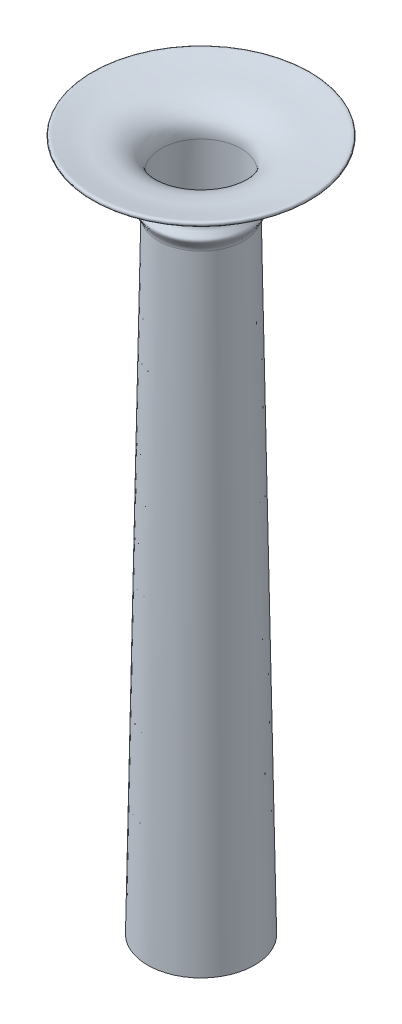
ISO-10303-21;
HEADER;
FILE_DESCRIPTION(('STEP AP214'),'2;1');
FILE_NAME('part.step','',(''),(''),'','','');
FILE_SCHEMA(('AUTOMOTIVE_DESIGN { 1 0 10303 214 1 1 1 1 }'));
ENDSEC;
DATA;
#1=APPLICATION_CONTEXT('core data for automotive mechanical design processes');
#2=APPLICATION_PROTOCOL_DEFINITION('international standard','automotive_design',2000,#1);
#3=PRODUCT_CONTEXT('',#1,'mechanical');
#4=PRODUCT('Part','Part','',(#3));
#5=PRODUCT_RELATED_PRODUCT_CATEGORY('part','',(#4));
#6=PRODUCT_DEFINITION_FORMATION('','',#4);
#7=PRODUCT_DEFINITION_CONTEXT('part definition',#1,'design');
#8=PRODUCT_DEFINITION('design','',#6,#7);
#9=PRODUCT_DEFINITION_SHAPE('','',#8);
#10=(LENGTH_UNIT() NAMED_UNIT(*) SI_UNIT(.MILLI.,.METRE.));
#11=(NAMED_UNIT(*) PLANE_ANGLE_UNIT() SI_UNIT($,.RADIAN.));
#12=(NAMED_UNIT(*) SI_UNIT($,.STERADIAN.) SOLID_ANGLE_UNIT());
#13=UNCERTAINTY_MEASURE_WITH_UNIT(LENGTH_MEASURE(1.E-05),#10,'distance_accuracy_value','');
#14=(GEOMETRIC_REPRESENTATION_CONTEXT(3) GLOBAL_UNCERTAINTY_ASSIGNED_CONTEXT((#13)) GLOBAL_UNIT_ASSIGNED_CONTEXT((#10,
#11,#12)) REPRESENTATION_CONTEXT('',''));
#15=CARTESIAN_POINT('',(0.,0.,0.));
#16=DIRECTION('',(0.,0.,1.));
#17=DIRECTION('',(1.,0.,0.));
#18=AXIS2_PLACEMENT_3D('',#15,#16,#17);
#19=CARTESIAN_POINT('',(-13.,0.,0.));
#20=DIRECTION('',(0.,1.,0.));
#21=DIRECTION('',(0.,0.,1.));
#22=AXIS2_PLACEMENT_3D('',#19,#20,#21);
#23=PLANE('',#22);
#24=CARTESIAN_POINT('',(0.,0.,0.));
#25=DIRECTION('',(0.,-1.,0.));
#26=DIRECTION('',(0.,0.,-1.));
#27=AXIS2_PLACEMENT_3D('',#24,#25,#26);
#28=CIRCLE('',#27,12.5);
#29=CARTESIAN_POINT('',(0.,0.,-12.5));
#30=VERTEX_POINT('',#29);
#31=EDGE_CURVE('E54',#30,#30,#28,.T.);
#32=ORIENTED_EDGE('',*,*,#31,.F.);
#33=EDGE_LOOP('',(#32));
#34=FACE_BOUND('',#33,.T.);
#35=CARTESIAN_POINT('',(0.,0.,0.));
#36=DIRECTION('',(0.,-1.,0.));
#37=DIRECTION('',(0.,0.,-1.));
#38=AXIS2_PLACEMENT_3D('',#35,#36,#37);
#39=CIRCLE('',#38,13.);
#40=CARTESIAN_POINT('',(0.,0.,-13.));
#41=VERTEX_POINT('',#40);
#42=EDGE_CURVE('E10',#41,#41,#39,.T.);
#43=ORIENTED_EDGE('',*,*,#42,.T.);
#44=EDGE_LOOP('',(#43));
#45=FACE_BOUND('',#44,.T.);
#46=ADVANCED_FACE('F37',(#34,#45),#23,.F.);
#47=CARTESIAN_POINT('',(0.,151.144169776624,0.));
#48=DIRECTION('',(0.,-1.,0.));
#49=DIRECTION('',(0.,0.,-1.));
#50=AXIS2_PLACEMENT_3D('',#47,#48,#49);
#51=CONICAL_SURFACE('',#50,10.361768703027,0.0174532925199466);
#52=ORIENTED_EDGE('',*,*,#42,.F.);
#53=EDGE_LOOP('',(#52));
#54=FACE_BOUND('',#53,.T.);
#55=CARTESIAN_POINT('',(0.,151.144169776624,0.));
#56=DIRECTION('',(0.,-1.,0.));
#57=DIRECTION('',(0.,0.,-1.));
#58=AXIS2_PLACEMENT_3D('',#55,#56,#57);
#59=CIRCLE('',#58,10.361768703027);
#60=CARTESIAN_POINT('',(0.,151.144169776624,-10.361768703027));
#61=VERTEX_POINT('',#60);
#62=EDGE_CURVE('E44',#61,#61,#59,.T.);
#63=ORIENTED_EDGE('',*,*,#62,.T.);
#64=EDGE_LOOP('',(#63));
#65=FACE_BOUND('',#64,.T.);
#66=ADVANCED_FACE('F71',(#54,#65),#51,.T.);
#67=CARTESIAN_POINT('',(-9.69681160603153,160.594555534212,0.));
#68=CARTESIAN_POINT('',(-9.66716567654713,162.292969696881,0.));
#69=CARTESIAN_POINT('',(-10.486474841471,164.306904024398,0.));
#70=CARTESIAN_POINT('',(-16.1277757150765,167.899610409735,0.));
#71=CARTESIAN_POINT('',(-20.2232821784111,166.81051942835,0.));
#72=CARTESIAN_POINT('',(-26.4969533358315,168.759464307396,0.));
#73=CARTESIAN_POINT('',(-26.5229356582708,167.69243524458,0.));
#74=CARTESIAN_POINT('',(-25.7428075289885,167.272952369076,0.));
#75=CARTESIAN_POINT('',(-24.3743754424741,167.74226998791,0.));
#76=CARTESIAN_POINT('',(-20.9432518143154,166.727581791958,0.));
#77=CARTESIAN_POINT('',(-15.6414339142492,167.397666688264,0.));
#78=CARTESIAN_POINT('',(-9.09004310961176,162.483051317006,0.));
#79=CARTESIAN_POINT('',(-10.8820491996311,159.060921848353,0.));
#80=CARTESIAN_POINT('',(-10.27049523168,157.544190842588,0.));
#81=CARTESIAN_POINT('',(-10.0688192509283,155.580238233363,0.));
#82=CARTESIAN_POINT('',(-12.1202581178016,154.371924787394,0.));
#83=CARTESIAN_POINT('',(-10.9631608693895,152.727148492962,0.));
#84=CARTESIAN_POINT('',(-10.3510486088464,151.758323560906,0.));
#85=CARTESIAN_POINT('',(-10.361768703027,151.144169776624,0.));
#86=B_SPLINE_CURVE_WITH_KNOTS('',3,(#67,#68,#69,#70,#71,#72,#73,#74,#75,#76,#77,#78,#79,#80,#81,
#82,#83,#84,#85),.UNSPECIFIED.,.F.,.F.,(4,1,1,1,1,1,1,1,1,1,1,1,1,1,1,1,4),(0.,
0.0824510520287445,0.139496152306933,0.376690167710711,0.407776511948641,0.416580186790101,
0.4304418237788,0.453143109770611,0.50108020509049,0.63725285347769,0.800463782654164,
0.826019519653659,0.852885947387157,0.896023812435237,0.93407044626154,0.960310185176692,1.),.UNSPECIFIED.);
#87=CARTESIAN_POINT('',(0.,0.,0.));
#88=DIRECTION('',(0.,-1.,0.));
#89=AXIS1_PLACEMENT('',#87,#88);
#90=SURFACE_OF_REVOLUTION('',#86,#89);
#91=ORIENTED_EDGE('',*,*,#62,.F.);
#92=EDGE_LOOP('',(#91));
#93=FACE_BOUND('',#92,.T.);
#94=CARTESIAN_POINT('',(0.,160.594555534212,0.));
#95=DIRECTION('',(0.,-1.,0.));
#96=DIRECTION('',(0.,0.,-1.));
#97=AXIS2_PLACEMENT_3D('',#94,#95,#96);
#98=CIRCLE('',#97,9.69681160603153);
#99=CARTESIAN_POINT('',(0.,160.594555534212,-9.69681160603153));
#100=VERTEX_POINT('',#99);
#101=EDGE_CURVE('E49',#100,#100,#98,.T.);
#102=ORIENTED_EDGE('',*,*,#101,.T.);
#103=EDGE_LOOP('',(#102));
#104=FACE_BOUND('',#103,.T.);
#105=ADVANCED_FACE('F67',(#93,#104),#90,.T.);
#106=CARTESIAN_POINT('',(0.,0.,0.));
#107=DIRECTION('',(0.,-1.,0.));
#108=DIRECTION('',(0.,0.,-1.));
#109=AXIS2_PLACEMENT_3D('',#106,#107,#108);
#110=CONICAL_SURFACE('',#109,12.5,0.0174532925199467);
#111=ORIENTED_EDGE('',*,*,#101,.F.);
#112=EDGE_LOOP('',(#111));
#113=FACE_BOUND('',#112,.T.);
#114=ORIENTED_EDGE('',*,*,#31,.T.);
#115=EDGE_LOOP('',(#114));
#116=FACE_BOUND('',#115,.T.);
#117=ADVANCED_FACE('F70',(#113,#116),#110,.F.);
#118=CLOSED_SHELL('',(#46,#66,#105,#117));
#119=MANIFOLD_SOLID_BREP('B2',#118);
#120=ADVANCED_BREP_SHAPE_REPRESENTATION('',(#18,#119),#14);
#121=SHAPE_DEFINITION_REPRESENTATION(#9,#120);
ENDSEC;
END-ISO-10303-21;
